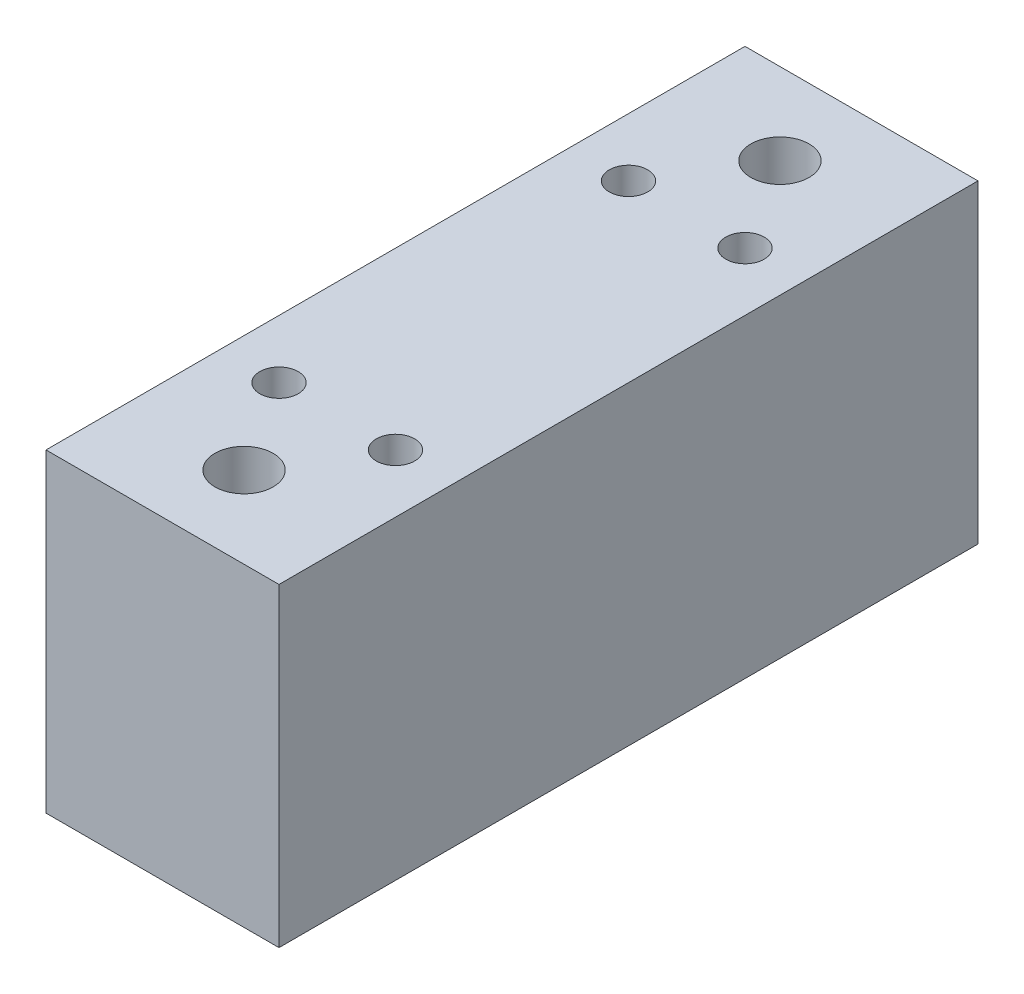
ISO-10303-21;
HEADER;
FILE_DESCRIPTION(('STEP AP214'),'2;1');
FILE_NAME('part.step','',(''),(''),'','','');
FILE_SCHEMA(('AUTOMOTIVE_DESIGN { 1 0 10303 214 1 1 1 1 }'));
ENDSEC;
DATA;
#1=APPLICATION_CONTEXT('core data for automotive mechanical design processes');
#2=APPLICATION_PROTOCOL_DEFINITION('international standard','automotive_design',2000,#1);
#3=PRODUCT_CONTEXT('',#1,'mechanical');
#4=PRODUCT('Part','Part','',(#3));
#5=PRODUCT_RELATED_PRODUCT_CATEGORY('part','',(#4));
#6=PRODUCT_DEFINITION_FORMATION('','',#4);
#7=PRODUCT_DEFINITION_CONTEXT('part definition',#1,'design');
#8=PRODUCT_DEFINITION('design','',#6,#7);
#9=PRODUCT_DEFINITION_SHAPE('','',#8);
#10=(LENGTH_UNIT() NAMED_UNIT(*) SI_UNIT(.MILLI.,.METRE.));
#11=(NAMED_UNIT(*) PLANE_ANGLE_UNIT() SI_UNIT($,.RADIAN.));
#12=(NAMED_UNIT(*) SI_UNIT($,.STERADIAN.) SOLID_ANGLE_UNIT());
#13=UNCERTAINTY_MEASURE_WITH_UNIT(LENGTH_MEASURE(1.E-05),#10,'distance_accuracy_value','');
#14=(GEOMETRIC_REPRESENTATION_CONTEXT(3) GLOBAL_UNCERTAINTY_ASSIGNED_CONTEXT((#13)) GLOBAL_UNIT_ASSIGNED_CONTEXT((#10,
#11,#12)) REPRESENTATION_CONTEXT('',''));
#15=CARTESIAN_POINT('',(0.,0.,0.));
#16=DIRECTION('',(0.,0.,1.));
#17=DIRECTION('',(1.,0.,0.));
#18=AXIS2_PLACEMENT_3D('',#15,#16,#17);
#19=CARTESIAN_POINT('',(-20.,13.5,60.));
#20=DIRECTION('',(0.,-1.,0.));
#21=DIRECTION('',(0.,0.,-1.));
#22=AXIS2_PLACEMENT_3D('',#19,#20,#21);
#23=PLANE('',#22);
#24=CARTESIAN_POINT('',(-5.,13.5,45.));
#25=DIRECTION('',(0.,1.,0.));
#26=DIRECTION('',(0.,0.,1.));
#27=AXIS2_PLACEMENT_3D('',#24,#25,#26);
#28=CIRCLE('',#27,1.65);
#29=CARTESIAN_POINT('',(-5.,13.5,46.65));
#30=VERTEX_POINT('',#29);
#31=EDGE_CURVE('E129',#30,#30,#28,.T.);
#32=ORIENTED_EDGE('',*,*,#31,.F.);
#33=EDGE_LOOP('',(#32));
#34=FACE_BOUND('',#33,.T.);
#35=CARTESIAN_POINT('',(-5.,13.5,15.));
#36=DIRECTION('',(0.,1.,0.));
#37=DIRECTION('',(0.,0.,1.));
#38=AXIS2_PLACEMENT_3D('',#35,#36,#37);
#39=CIRCLE('',#38,1.65);
#40=CARTESIAN_POINT('',(-5.,13.5,16.65));
#41=VERTEX_POINT('',#40);
#42=EDGE_CURVE('E123',#41,#41,#39,.T.);
#43=ORIENTED_EDGE('',*,*,#42,.F.);
#44=EDGE_LOOP('',(#43));
#45=FACE_BOUND('',#44,.T.);
#46=CARTESIAN_POINT('',(-15.,13.5,45.));
#47=DIRECTION('',(0.,1.,0.));
#48=DIRECTION('',(0.,0.,1.));
#49=AXIS2_PLACEMENT_3D('',#46,#47,#48);
#50=CIRCLE('',#49,1.65);
#51=CARTESIAN_POINT('',(-15.,13.5,46.65));
#52=VERTEX_POINT('',#51);
#53=EDGE_CURVE('E111',#52,#52,#50,.T.);
#54=ORIENTED_EDGE('',*,*,#53,.F.);
#55=EDGE_LOOP('',(#54));
#56=FACE_BOUND('',#55,.T.);
#57=CARTESIAN_POINT('',(-15.,13.5,15.));
#58=DIRECTION('',(0.,1.,0.));
#59=DIRECTION('',(0.,0.,1.));
#60=AXIS2_PLACEMENT_3D('',#57,#58,#59);
#61=CIRCLE('',#60,1.65);
#62=CARTESIAN_POINT('',(-15.,13.5,16.65));
#63=VERTEX_POINT('',#62);
#64=EDGE_CURVE('E105',#63,#63,#61,.T.);
#65=ORIENTED_EDGE('',*,*,#64,.F.);
#66=EDGE_LOOP('',(#65));
#67=FACE_BOUND('',#66,.T.);
#68=CARTESIAN_POINT('',(-9.99999999999999,13.5,53.));
#69=DIRECTION('',(0.,1.,0.));
#70=DIRECTION('',(-1.,0.,0.));
#71=AXIS2_PLACEMENT_3D('',#68,#69,#70);
#72=CIRCLE('',#71,2.5);
#73=CARTESIAN_POINT('',(-12.5,13.5,53.));
#74=VERTEX_POINT('',#73);
#75=EDGE_CURVE('E99',#74,#74,#72,.T.);
#76=ORIENTED_EDGE('',*,*,#75,.F.);
#77=EDGE_LOOP('',(#76));
#78=FACE_BOUND('',#77,.T.);
#79=CARTESIAN_POINT('',(-9.99999999999999,13.5,7.));
#80=DIRECTION('',(0.,1.,0.));
#81=DIRECTION('',(-1.,0.,0.));
#82=AXIS2_PLACEMENT_3D('',#79,#80,#81);
#83=CIRCLE('',#82,2.5);
#84=CARTESIAN_POINT('',(-12.5,13.5,7.));
#85=VERTEX_POINT('',#84);
#86=EDGE_CURVE('E93',#85,#85,#83,.T.);
#87=ORIENTED_EDGE('',*,*,#86,.F.);
#88=EDGE_LOOP('',(#87));
#89=FACE_BOUND('',#88,.T.);
#90=DIRECTION('',(-1.,0.,0.));
#91=VECTOR('',#90,1.);
#92=CARTESIAN_POINT('',(-20.,13.5,60.));
#93=LINE('',#92,#91);
#94=CARTESIAN_POINT('',(0.,13.5,60.));
#95=VERTEX_POINT('',#94);
#96=CARTESIAN_POINT('',(-20.,13.5,60.));
#97=VERTEX_POINT('',#96);
#98=EDGE_CURVE('E85',#95,#97,#93,.T.);
#99=ORIENTED_EDGE('',*,*,#98,.F.);
#100=DIRECTION('',(0.,0.,-1.));
#101=VECTOR('',#100,1.);
#102=CARTESIAN_POINT('',(0.,13.5,60.));
#103=LINE('',#102,#101);
#104=CARTESIAN_POINT('',(0.,13.5,0.));
#105=VERTEX_POINT('',#104);
#106=EDGE_CURVE('E114',#95,#105,#103,.T.);
#107=ORIENTED_EDGE('',*,*,#106,.T.);
#108=DIRECTION('',(-1.,0.,0.));
#109=VECTOR('',#108,1.);
#110=CARTESIAN_POINT('',(-20.,13.5,0.));
#111=LINE('',#110,#109);
#112=CARTESIAN_POINT('',(-20.,13.5,0.));
#113=VERTEX_POINT('',#112);
#114=EDGE_CURVE('E77',#105,#113,#111,.T.);
#115=ORIENTED_EDGE('',*,*,#114,.T.);
#116=DIRECTION('',(0.,0.,-1.));
#117=VECTOR('',#116,1.);
#118=CARTESIAN_POINT('',(-20.,13.5,60.));
#119=LINE('',#118,#117);
#120=EDGE_CURVE('E39',#97,#113,#119,.T.);
#121=ORIENTED_EDGE('',*,*,#120,.F.);
#122=EDGE_LOOP('',(#99,#107,#115,#121));
#123=FACE_BOUND('',#122,.T.);
#124=ADVANCED_FACE('F32',(#34,#45,#56,#67,#78,#89,#123),#23,.F.);
#125=CARTESIAN_POINT('',(-20.,13.5,60.));
#126=DIRECTION('',(1.,0.,0.));
#127=DIRECTION('',(0.,0.,-1.));
#128=AXIS2_PLACEMENT_3D('',#125,#126,#127);
#129=PLANE('',#128);
#130=DIRECTION('',(0.,-1.,0.));
#131=VECTOR('',#130,1.);
#132=CARTESIAN_POINT('',(-20.,13.5,0.));
#133=LINE('',#132,#131);
#134=CARTESIAN_POINT('',(-20.,-13.5,0.));
#135=VERTEX_POINT('',#134);
#136=EDGE_CURVE('E67',#113,#135,#133,.T.);
#137=ORIENTED_EDGE('',*,*,#136,.T.);
#138=DIRECTION('',(0.,0.,-1.));
#139=VECTOR('',#138,1.);
#140=CARTESIAN_POINT('',(-20.,-13.5,60.));
#141=LINE('',#140,#139);
#142=CARTESIAN_POINT('',(-20.,-13.5,60.));
#143=VERTEX_POINT('',#142);
#144=EDGE_CURVE('E70',#143,#135,#141,.T.);
#145=ORIENTED_EDGE('',*,*,#144,.F.);
#146=DIRECTION('',(0.,-1.,0.));
#147=VECTOR('',#146,1.);
#148=CARTESIAN_POINT('',(-20.,13.5,60.));
#149=LINE('',#148,#147);
#150=EDGE_CURVE('E54',#97,#143,#149,.T.);
#151=ORIENTED_EDGE('',*,*,#150,.F.);
#152=ORIENTED_EDGE('',*,*,#120,.T.);
#153=EDGE_LOOP('',(#137,#145,#151,#152));
#154=FACE_BOUND('',#153,.T.);
#155=ADVANCED_FACE('F69',(#154),#129,.F.);
#156=CARTESIAN_POINT('',(-20.,-13.5,60.));
#157=DIRECTION('',(0.,1.,0.));
#158=DIRECTION('',(0.,0.,1.));
#159=AXIS2_PLACEMENT_3D('',#156,#157,#158);
#160=PLANE('',#159);
#161=CARTESIAN_POINT('',(-5.,-13.5,45.));
#162=DIRECTION('',(0.,1.,0.));
#163=DIRECTION('',(0.,0.,1.));
#164=AXIS2_PLACEMENT_3D('',#161,#162,#163);
#165=CIRCLE('',#164,1.65);
#166=CARTESIAN_POINT('',(-5.,-13.5,46.65));
#167=VERTEX_POINT('',#166);
#168=EDGE_CURVE('E126',#167,#167,#165,.T.);
#169=ORIENTED_EDGE('',*,*,#168,.T.);
#170=EDGE_LOOP('',(#169));
#171=FACE_BOUND('',#170,.T.);
#172=CARTESIAN_POINT('',(-5.,-13.5,15.));
#173=DIRECTION('',(0.,1.,0.));
#174=DIRECTION('',(0.,0.,1.));
#175=AXIS2_PLACEMENT_3D('',#172,#173,#174);
#176=CIRCLE('',#175,1.65);
#177=CARTESIAN_POINT('',(-5.,-13.5,16.65));
#178=VERTEX_POINT('',#177);
#179=EDGE_CURVE('E122',#178,#178,#176,.T.);
#180=ORIENTED_EDGE('',*,*,#179,.T.);
#181=EDGE_LOOP('',(#180));
#182=FACE_BOUND('',#181,.T.);
#183=CARTESIAN_POINT('',(-15.,-13.5,45.));
#184=DIRECTION('',(0.,1.,0.));
#185=DIRECTION('',(0.,0.,1.));
#186=AXIS2_PLACEMENT_3D('',#183,#184,#185);
#187=CIRCLE('',#186,1.65);
#188=CARTESIAN_POINT('',(-15.,-13.5,46.65));
#189=VERTEX_POINT('',#188);
#190=EDGE_CURVE('E108',#189,#189,#187,.T.);
#191=ORIENTED_EDGE('',*,*,#190,.T.);
#192=EDGE_LOOP('',(#191));
#193=FACE_BOUND('',#192,.T.);
#194=CARTESIAN_POINT('',(-15.,-13.5,15.));
#195=DIRECTION('',(0.,1.,0.));
#196=DIRECTION('',(0.,0.,1.));
#197=AXIS2_PLACEMENT_3D('',#194,#195,#196);
#198=CIRCLE('',#197,1.65);
#199=CARTESIAN_POINT('',(-15.,-13.5,16.65));
#200=VERTEX_POINT('',#199);
#201=EDGE_CURVE('E102',#200,#200,#198,.T.);
#202=ORIENTED_EDGE('',*,*,#201,.T.);
#203=EDGE_LOOP('',(#202));
#204=FACE_BOUND('',#203,.T.);
#205=CARTESIAN_POINT('',(-9.99999999999999,-13.5,53.));
#206=DIRECTION('',(0.,1.,0.));
#207=DIRECTION('',(-1.,0.,0.));
#208=AXIS2_PLACEMENT_3D('',#205,#206,#207);
#209=CIRCLE('',#208,2.5);
#210=CARTESIAN_POINT('',(-12.5,-13.5,53.));
#211=VERTEX_POINT('',#210);
#212=EDGE_CURVE('E96',#211,#211,#209,.T.);
#213=ORIENTED_EDGE('',*,*,#212,.T.);
#214=EDGE_LOOP('',(#213));
#215=FACE_BOUND('',#214,.T.);
#216=CARTESIAN_POINT('',(-9.99999999999999,-13.5,7.));
#217=DIRECTION('',(0.,1.,0.));
#218=DIRECTION('',(-1.,0.,0.));
#219=AXIS2_PLACEMENT_3D('',#216,#217,#218);
#220=CIRCLE('',#219,2.5);
#221=CARTESIAN_POINT('',(-12.5,-13.5,7.));
#222=VERTEX_POINT('',#221);
#223=EDGE_CURVE('E90',#222,#222,#220,.T.);
#224=ORIENTED_EDGE('',*,*,#223,.T.);
#225=EDGE_LOOP('',(#224));
#226=FACE_BOUND('',#225,.T.);
#227=DIRECTION('',(1.,0.,0.));
#228=VECTOR('',#227,1.);
#229=CARTESIAN_POINT('',(-20.,-13.5,0.));
#230=LINE('',#229,#228);
#231=CARTESIAN_POINT('',(0.,-13.5,0.));
#232=VERTEX_POINT('',#231);
#233=EDGE_CURVE('E76',#135,#232,#230,.T.);
#234=ORIENTED_EDGE('',*,*,#233,.T.);
#235=DIRECTION('',(0.,0.,-1.));
#236=VECTOR('',#235,1.);
#237=CARTESIAN_POINT('',(0.,-13.5,60.));
#238=LINE('',#237,#236);
#239=CARTESIAN_POINT('',(0.,-13.5,60.));
#240=VERTEX_POINT('',#239);
#241=EDGE_CURVE('E46',#240,#232,#238,.T.);
#242=ORIENTED_EDGE('',*,*,#241,.F.);
#243=DIRECTION('',(1.,0.,0.));
#244=VECTOR('',#243,1.);
#245=CARTESIAN_POINT('',(-20.,-13.5,60.));
#246=LINE('',#245,#244);
#247=EDGE_CURVE('E82',#143,#240,#246,.T.);
#248=ORIENTED_EDGE('',*,*,#247,.F.);
#249=ORIENTED_EDGE('',*,*,#144,.T.);
#250=EDGE_LOOP('',(#234,#242,#248,#249));
#251=FACE_BOUND('',#250,.T.);
#252=ADVANCED_FACE('F81',(#171,#182,#193,#204,#215,#226,#251),#160,.F.);
#253=CARTESIAN_POINT('',(0.,0.,60.));
#254=DIRECTION('',(0.,0.,1.));
#255=DIRECTION('',(1.,0.,0.));
#256=AXIS2_PLACEMENT_3D('',#253,#254,#255);
#257=PLANE('',#256);
#258=DIRECTION('',(0.,-1.,0.));
#259=VECTOR('',#258,1.);
#260=CARTESIAN_POINT('',(0.,16.5,60.));
#261=LINE('',#260,#259);
#262=EDGE_CURVE('E119',#95,#240,#261,.T.);
#263=ORIENTED_EDGE('',*,*,#262,.F.);
#264=ORIENTED_EDGE('',*,*,#98,.T.);
#265=ORIENTED_EDGE('',*,*,#150,.T.);
#266=ORIENTED_EDGE('',*,*,#247,.T.);
#267=EDGE_LOOP('',(#263,#264,#265,#266));
#268=FACE_BOUND('',#267,.T.);
#269=ADVANCED_FACE('F162',(#268),#257,.T.);
#270=CARTESIAN_POINT('',(0.,0.,0.));
#271=DIRECTION('',(0.,0.,1.));
#272=DIRECTION('',(1.,0.,0.));
#273=AXIS2_PLACEMENT_3D('',#270,#271,#272);
#274=PLANE('',#273);
#275=ORIENTED_EDGE('',*,*,#114,.F.);
#276=DIRECTION('',(0.,-1.,0.));
#277=VECTOR('',#276,1.);
#278=CARTESIAN_POINT('',(0.,0.,0.));
#279=LINE('',#278,#277);
#280=EDGE_CURVE('E11',#105,#232,#279,.T.);
#281=ORIENTED_EDGE('',*,*,#280,.T.);
#282=ORIENTED_EDGE('',*,*,#233,.F.);
#283=ORIENTED_EDGE('',*,*,#136,.F.);
#284=EDGE_LOOP('',(#275,#281,#282,#283));
#285=FACE_BOUND('',#284,.T.);
#286=ADVANCED_FACE('F84',(#285),#274,.F.);
#287=CARTESIAN_POINT('',(-9.99999999999999,-13.5,7.));
#288=DIRECTION('',(0.,1.,0.));
#289=DIRECTION('',(-1.,0.,0.));
#290=AXIS2_PLACEMENT_3D('',#287,#288,#289);
#291=CYLINDRICAL_SURFACE('',#290,2.5);
#292=ORIENTED_EDGE('',*,*,#223,.F.);
#293=EDGE_LOOP('',(#292));
#294=FACE_BOUND('',#293,.T.);
#295=ORIENTED_EDGE('',*,*,#86,.T.);
#296=EDGE_LOOP('',(#295));
#297=FACE_BOUND('',#296,.T.);
#298=ADVANCED_FACE('F184',(#294,#297),#291,.F.);
#299=CARTESIAN_POINT('',(-9.99999999999999,-13.5,53.));
#300=DIRECTION('',(0.,1.,0.));
#301=DIRECTION('',(-1.,0.,0.));
#302=AXIS2_PLACEMENT_3D('',#299,#300,#301);
#303=CYLINDRICAL_SURFACE('',#302,2.5);
#304=ORIENTED_EDGE('',*,*,#212,.F.);
#305=EDGE_LOOP('',(#304));
#306=FACE_BOUND('',#305,.T.);
#307=ORIENTED_EDGE('',*,*,#75,.T.);
#308=EDGE_LOOP('',(#307));
#309=FACE_BOUND('',#308,.T.);
#310=ADVANCED_FACE('F180',(#306,#309),#303,.F.);
#311=CARTESIAN_POINT('',(-15.,-13.5,15.));
#312=DIRECTION('',(0.,1.,0.));
#313=DIRECTION('',(0.,0.,1.));
#314=AXIS2_PLACEMENT_3D('',#311,#312,#313);
#315=CYLINDRICAL_SURFACE('',#314,1.65);
#316=ORIENTED_EDGE('',*,*,#201,.F.);
#317=EDGE_LOOP('',(#316));
#318=FACE_BOUND('',#317,.T.);
#319=ORIENTED_EDGE('',*,*,#64,.T.);
#320=EDGE_LOOP('',(#319));
#321=FACE_BOUND('',#320,.T.);
#322=ADVANCED_FACE('F174',(#318,#321),#315,.F.);
#323=CARTESIAN_POINT('',(-15.,-13.5,45.));
#324=DIRECTION('',(0.,1.,0.));
#325=DIRECTION('',(0.,0.,1.));
#326=AXIS2_PLACEMENT_3D('',#323,#324,#325);
#327=CYLINDRICAL_SURFACE('',#326,1.65);
#328=ORIENTED_EDGE('',*,*,#190,.F.);
#329=EDGE_LOOP('',(#328));
#330=FACE_BOUND('',#329,.T.);
#331=ORIENTED_EDGE('',*,*,#53,.T.);
#332=EDGE_LOOP('',(#331));
#333=FACE_BOUND('',#332,.T.);
#334=ADVANCED_FACE('F166',(#330,#333),#327,.F.);
#335=CARTESIAN_POINT('',(0.,16.5,60.));
#336=DIRECTION('',(-1.,0.,0.));
#337=DIRECTION('',(0.,0.,1.));
#338=AXIS2_PLACEMENT_3D('',#335,#336,#337);
#339=PLANE('',#338);
#340=ORIENTED_EDGE('',*,*,#262,.T.);
#341=ORIENTED_EDGE('',*,*,#241,.T.);
#342=ORIENTED_EDGE('',*,*,#280,.F.);
#343=ORIENTED_EDGE('',*,*,#106,.F.);
#344=EDGE_LOOP('',(#340,#341,#342,#343));
#345=FACE_BOUND('',#344,.T.);
#346=ADVANCED_FACE('F163',(#345),#339,.F.);
#347=CARTESIAN_POINT('',(-5.,-13.5,15.));
#348=DIRECTION('',(0.,1.,0.));
#349=DIRECTION('',(0.,0.,1.));
#350=AXIS2_PLACEMENT_3D('',#347,#348,#349);
#351=CYLINDRICAL_SURFACE('',#350,1.65);
#352=ORIENTED_EDGE('',*,*,#179,.F.);
#353=EDGE_LOOP('',(#352));
#354=FACE_BOUND('',#353,.T.);
#355=ORIENTED_EDGE('',*,*,#42,.T.);
#356=EDGE_LOOP('',(#355));
#357=FACE_BOUND('',#356,.T.);
#358=ADVANCED_FACE('F140',(#354,#357),#351,.F.);
#359=CARTESIAN_POINT('',(-5.,-13.5,45.));
#360=DIRECTION('',(0.,1.,0.));
#361=DIRECTION('',(0.,0.,1.));
#362=AXIS2_PLACEMENT_3D('',#359,#360,#361);
#363=CYLINDRICAL_SURFACE('',#362,1.65);
#364=ORIENTED_EDGE('',*,*,#168,.F.);
#365=EDGE_LOOP('',(#364));
#366=FACE_BOUND('',#365,.T.);
#367=ORIENTED_EDGE('',*,*,#31,.T.);
#368=EDGE_LOOP('',(#367));
#369=FACE_BOUND('',#368,.T.);
#370=ADVANCED_FACE('F137',(#366,#369),#363,.F.);
#371=CLOSED_SHELL('',(#124,#155,#252,#269,#286,#298,#310,#322,#334,#346,#358,#370));
#372=MANIFOLD_SOLID_BREP('B2',#371);
#373=ADVANCED_BREP_SHAPE_REPRESENTATION('',(#18,#372),#14);
#374=SHAPE_DEFINITION_REPRESENTATION(#9,#373);
ENDSEC;
END-ISO-10303-21;
